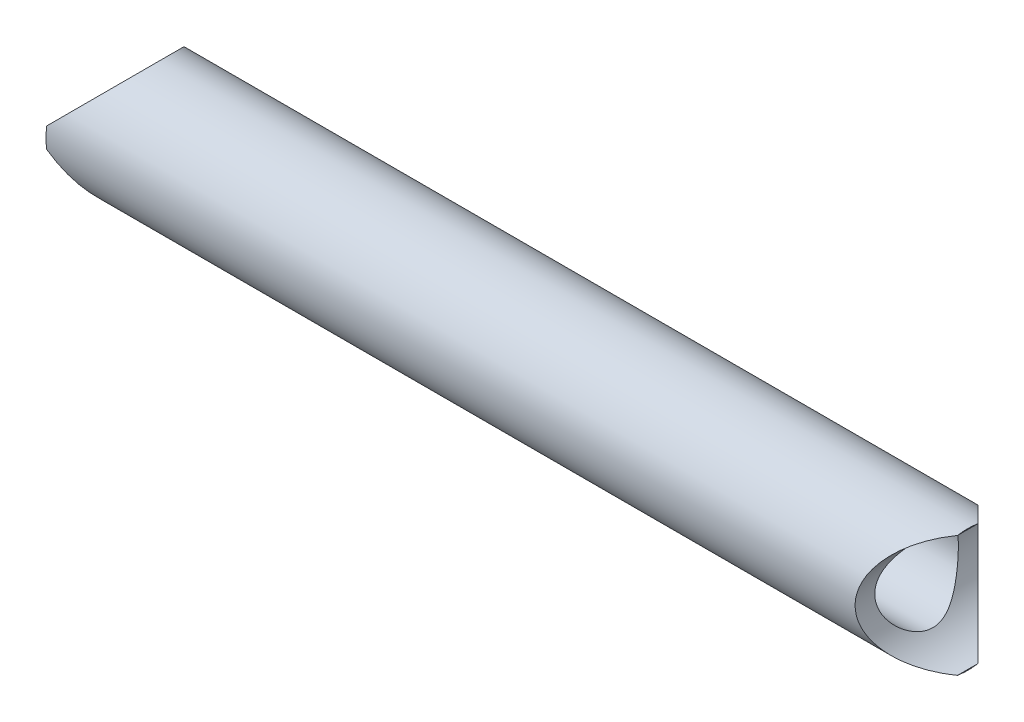
ISO-10303-21;
HEADER;
FILE_DESCRIPTION(('STEP AP214'),'2;1');
FILE_NAME('part.step','',(''),(''),'','','');
FILE_SCHEMA(('AUTOMOTIVE_DESIGN { 1 0 10303 214 1 1 1 1 }'));
ENDSEC;
DATA;
#1=APPLICATION_CONTEXT('core data for automotive mechanical design processes');
#2=APPLICATION_PROTOCOL_DEFINITION('international standard','automotive_design',2000,#1);
#3=PRODUCT_CONTEXT('',#1,'mechanical');
#4=PRODUCT('Part','Part','',(#3));
#5=PRODUCT_RELATED_PRODUCT_CATEGORY('part','',(#4));
#6=PRODUCT_DEFINITION_FORMATION('','',#4);
#7=PRODUCT_DEFINITION_CONTEXT('part definition',#1,'design');
#8=PRODUCT_DEFINITION('design','',#6,#7);
#9=PRODUCT_DEFINITION_SHAPE('','',#8);
#10=(LENGTH_UNIT() NAMED_UNIT(*) SI_UNIT(.MILLI.,.METRE.));
#11=(NAMED_UNIT(*) PLANE_ANGLE_UNIT() SI_UNIT($,.RADIAN.));
#12=(NAMED_UNIT(*) SI_UNIT($,.STERADIAN.) SOLID_ANGLE_UNIT());
#13=UNCERTAINTY_MEASURE_WITH_UNIT(LENGTH_MEASURE(1.E-05),#10,'distance_accuracy_value','');
#14=(GEOMETRIC_REPRESENTATION_CONTEXT(3) GLOBAL_UNCERTAINTY_ASSIGNED_CONTEXT((#13)) GLOBAL_UNIT_ASSIGNED_CONTEXT((#10,
#11,#12)) REPRESENTATION_CONTEXT('',''));
#15=CARTESIAN_POINT('',(0.,0.,0.));
#16=DIRECTION('',(0.,0.,1.));
#17=DIRECTION('',(1.,0.,0.));
#18=AXIS2_PLACEMENT_3D('',#15,#16,#17);
#19=CARTESIAN_POINT('',(-66.675,0.,0.));
#20=DIRECTION('',(1.,0.,0.));
#21=DIRECTION('',(0.,0.,-1.));
#22=AXIS2_PLACEMENT_3D('',#19,#20,#21);
#23=PLANE('',#22);
#24=DIRECTION('',(0.,1.,0.));
#25=VECTOR('',#24,1.);
#26=CARTESIAN_POINT('',(-66.6749999999999,-65.5701,9.39177665567062));
#27=LINE('',#26,#25);
#28=CARTESIAN_POINT('',(-66.6749999999999,1.58750000000007,9.39177665567063));
#29=VERTEX_POINT('',#28);
#30=CARTESIAN_POINT('',(-66.6749999999999,-1.58750000000006,9.39177665567063));
#31=VERTEX_POINT('',#30);
#32=EDGE_CURVE('E120',#29,#31,#27,.F.);
#33=ORIENTED_EDGE('',*,*,#32,.T.);
#34=CARTESIAN_POINT('',(-66.675,0.,0.));
#35=DIRECTION('',(1.,0.,0.));
#36=DIRECTION('',(0.,0.,-1.));
#37=AXIS2_PLACEMENT_3D('',#34,#35,#36);
#38=CIRCLE('',#37,9.525);
#39=EDGE_CURVE('E67',#29,#31,#38,.T.);
#40=ORIENTED_EDGE('',*,*,#39,.F.);
#41=EDGE_LOOP('',(#33,#40));
#42=FACE_BOUND('',#41,.T.);
#43=ADVANCED_FACE('F17',(#42),#23,.F.);
#44=CARTESIAN_POINT('',(66.675,0.,0.));
#45=DIRECTION('',(1.,0.,0.));
#46=DIRECTION('',(0.,0.,-1.));
#47=AXIS2_PLACEMENT_3D('',#44,#45,#46);
#48=PLANE('',#47);
#49=CARTESIAN_POINT('',(66.675,0.,0.));
#50=DIRECTION('',(1.,0.,0.));
#51=DIRECTION('',(0.,0.,-1.));
#52=AXIS2_PLACEMENT_3D('',#49,#50,#51);
#53=CIRCLE('',#52,9.525);
#54=CARTESIAN_POINT('',(66.6749999999999,-9.39177665567063,-1.58750000000006));
#55=VERTEX_POINT('',#54);
#56=CARTESIAN_POINT('',(66.6749999999999,-9.39177665567063,1.58750000000006));
#57=VERTEX_POINT('',#56);
#58=EDGE_CURVE('E62',#55,#57,#53,.F.);
#59=ORIENTED_EDGE('',*,*,#58,.F.);
#60=DIRECTION('',(0.,0.,1.));
#61=VECTOR('',#60,1.);
#62=CARTESIAN_POINT('',(66.6749999999999,-9.39177665567062,-17.0053));
#63=LINE('',#62,#61);
#64=EDGE_CURVE('E65',#55,#57,#63,.T.);
#65=ORIENTED_EDGE('',*,*,#64,.T.);
#66=EDGE_LOOP('',(#59,#65));
#67=FACE_BOUND('',#66,.T.);
#68=ADVANCED_FACE('F64',(#67),#48,.T.);
#69=CARTESIAN_POINT('',(66.675,0.,0.));
#70=DIRECTION('',(1.,0.,0.));
#71=DIRECTION('',(0.,0.,-1.));
#72=AXIS2_PLACEMENT_3D('',#69,#70,#71);
#73=PLANE('',#72);
#74=CARTESIAN_POINT('',(66.675,0.,0.));
#75=DIRECTION('',(1.,0.,0.));
#76=DIRECTION('',(0.,0.,-1.));
#77=AXIS2_PLACEMENT_3D('',#74,#75,#76);
#78=CIRCLE('',#77,9.525);
#79=CARTESIAN_POINT('',(66.6749999999999,9.39177665567063,1.58750000000006));
#80=VERTEX_POINT('',#79);
#81=CARTESIAN_POINT('',(66.6749999999999,9.39177665567063,-1.58750000000006));
#82=VERTEX_POINT('',#81);
#83=EDGE_CURVE('E37',#80,#82,#78,.F.);
#84=ORIENTED_EDGE('',*,*,#83,.F.);
#85=DIRECTION('',(0.,0.,1.));
#86=VECTOR('',#85,1.);
#87=CARTESIAN_POINT('',(66.6749999999999,9.39177665567062,-17.0053));
#88=LINE('',#87,#86);
#89=EDGE_CURVE('E98',#80,#82,#88,.F.);
#90=ORIENTED_EDGE('',*,*,#89,.T.);
#91=EDGE_LOOP('',(#84,#90));
#92=FACE_BOUND('',#91,.T.);
#93=ADVANCED_FACE('F105',(#92),#73,.T.);
#94=CARTESIAN_POINT('',(-66.675,0.,0.));
#95=DIRECTION('',(1.,0.,0.));
#96=DIRECTION('',(0.,0.,-1.));
#97=AXIS2_PLACEMENT_3D('',#94,#95,#96);
#98=CYLINDRICAL_SURFACE('',#97,6.477);
#99=CARTESIAN_POINT('',(-58.7375,-6.477,0.));
#100=CARTESIAN_POINT('',(-58.7375009309845,-6.47699902063564,0.161859991408696));
#101=CARTESIAN_POINT('',(-58.7416352313017,-6.47092347500914,0.323737483139682));
#102=CARTESIAN_POINT('',(-58.7580749166082,-6.44671059452453,0.646234711803034));
#103=CARTESIAN_POINT('',(-58.7703842455682,-6.42856743774703,0.806853803769705));
#104=CARTESIAN_POINT('',(-58.8028997592258,-6.38045887651486,1.12575090691301));
#105=CARTESIAN_POINT('',(-58.8231180709292,-6.35047531625192,1.28402493369037));
#106=CARTESIAN_POINT('',(-58.8709817462166,-6.2791097005026,1.59689476580041));
#107=CARTESIAN_POINT('',(-58.8986303199144,-6.23772271817282,1.751488949823));
#108=CARTESIAN_POINT('',(-58.9605506121295,-6.14437797195406,2.05504483319672));
#109=CARTESIAN_POINT('',(-58.994782172855,-6.09248420539763,2.20403444783158));
#110=CARTESIAN_POINT('',(-59.0692624051674,-5.97857585926296,2.49656391181815));
#111=CARTESIAN_POINT('',(-59.1095134274708,-5.91655732489571,2.64010160450527));
#112=CARTESIAN_POINT('',(-59.2380912058379,-5.71632729768525,3.06131037303474));
#113=CARTESIAN_POINT('',(-59.3343193109037,-5.56382831896324,3.32993886835331));
#114=CARTESIAN_POINT('',(-59.5499985369299,-5.21102308701011,3.86098804990281));
#115=CARTESIAN_POINT('',(-59.6707381932386,-5.00772336343045,4.12086383877963));
#116=CARTESIAN_POINT('',(-59.9203942871404,-4.56617268089548,4.60533984344896));
#117=CARTESIAN_POINT('',(-60.0493229509605,-4.3278687295286,4.82988548670452));
#118=CARTESIAN_POINT('',(-60.2518596404119,-3.92587947637852,5.15511939740143));
#119=CARTESIAN_POINT('',(-60.3261149176989,-3.77252181201225,5.26840752743897));
#120=CARTESIAN_POINT('',(-60.4718575832968,-3.45541080784627,5.48162066039673));
#121=CARTESIAN_POINT('',(-60.5433443038706,-3.29165498498653,5.58154245362993));
#122=CARTESIAN_POINT('',(-60.6809796979498,-2.9544879902085,5.76710565973809));
#123=CARTESIAN_POINT('',(-60.7471368218877,-2.78109287058017,5.85276991837298));
#124=CARTESIAN_POINT('',(-60.8715443252917,-2.42486119568457,6.00910844296647));
#125=CARTESIAN_POINT('',(-60.9297945662624,-2.2420244751174,6.07978244637075));
#126=CARTESIAN_POINT('',(-61.0196570022767,-1.92367949535164,6.18628784096023));
#127=CARTESIAN_POINT('',(-61.0540332217872,-1.79031358505837,6.22622506177775));
#128=CARTESIAN_POINT('',(-61.1163894902453,-1.51989866178684,6.29769648410807));
#129=CARTESIAN_POINT('',(-61.1443713592678,-1.3828507093011,6.32923307718305));
#130=CARTESIAN_POINT('',(-61.1929437695523,-1.10592771933484,6.38344162112075));
#131=CARTESIAN_POINT('',(-61.2135452631584,-0.96605719908589,6.40612671195239));
#132=CARTESIAN_POINT('',(-61.2466180396443,-0.684169243413158,6.44233112113181));
#133=CARTESIAN_POINT('',(-61.2590893004972,-0.542151802173897,6.45585041464713));
#134=CARTESIAN_POINT('',(-61.2754143867462,-0.256348970234707,6.47351588669589));
#135=CARTESIAN_POINT('',(-61.2792266766402,-0.11255837083368,6.47761688844381));
#136=CARTESIAN_POINT('',(-61.2779433268486,0.174934617387533,6.47623293328364));
#137=CARTESIAN_POINT('',(-61.2728476835599,0.318637006172016,6.4707479724982));
#138=CARTESIAN_POINT('',(-61.2539644766221,0.604877368980779,6.45029057713175));
#139=CARTESIAN_POINT('',(-61.2401714756774,0.747414558054186,6.43531220756058));
#140=CARTESIAN_POINT('',(-61.204482809079,1.03015441555673,6.39614774621474));
#141=CARTESIAN_POINT('',(-61.1825869583412,1.17035703058341,6.37196144411342));
#142=CARTESIAN_POINT('',(-61.1086643114976,1.57151737734538,6.28916546635215));
#143=CARTESIAN_POINT('',(-61.0471941561119,1.82846527571214,6.21910574963729));
#144=CARTESIAN_POINT('',(-60.9050680101041,2.32704967278988,6.05027939563834));
#145=CARTESIAN_POINT('',(-60.8243971590256,2.56867412750302,5.95149051009416));
#146=CARTESIAN_POINT('',(-60.6730152437242,2.97524781039389,5.75642971591142));
#147=CARTESIAN_POINT('',(-60.605009123286,3.14403898346143,5.66593829377763));
#148=CARTESIAN_POINT('',(-60.4647293821883,3.471754534595,5.47126926165319));
#149=CARTESIAN_POINT('',(-60.392454186027,3.63067522500949,5.36708658131105));
#150=CARTESIAN_POINT('',(-60.2458300224296,3.9384300509092,5.14551354529919));
#151=CARTESIAN_POINT('',(-60.1714778932225,4.08724747553892,5.02810212298997));
#152=CARTESIAN_POINT('',(-60.0228775284381,4.37405079028782,4.78069737839076));
#153=CARTESIAN_POINT('',(-59.9486292815466,4.51203796771267,4.65070555554734));
#154=CARTESIAN_POINT('',(-59.801496934869,4.7777417550274,4.37736795593037));
#155=CARTESIAN_POINT('',(-59.7286300847361,4.9053597052468,4.23391683747296));
#156=CARTESIAN_POINT('',(-59.5867660040007,5.14820099638157,3.93505085849178));
#157=CARTESIAN_POINT('',(-59.5177691424325,5.26342315621798,3.77963486036259));
#158=CARTESIAN_POINT('',(-59.385533224316,5.48031192519517,3.45764864801704));
#159=CARTESIAN_POINT('',(-59.3222861594534,5.58199748275943,3.29109452645894));
#160=CARTESIAN_POINT('',(-59.2031853095816,5.77082786323259,2.9474527949776));
#161=CARTESIAN_POINT('',(-59.1473290729144,5.85797751045143,2.77036870641004));
#162=CARTESIAN_POINT('',(-59.0560056820141,5.99897047854086,2.44698855291379));
#163=CARTESIAN_POINT('',(-59.0187608551921,6.05591773029685,2.30253994989054));
#164=CARTESIAN_POINT('',(-58.9504752329718,6.1596457176452,2.00862296214987));
#165=CARTESIAN_POINT('',(-58.9194331975385,6.2064284854405,1.85915558775619));
#166=CARTESIAN_POINT('',(-58.8642534951206,6.28918836563251,1.55634958893366));
#167=CARTESIAN_POINT('',(-58.8401016523863,6.32518767146095,1.40301962952514));
#168=CARTESIAN_POINT('',(-58.7991588939474,6.3860188295028,1.09324664274338));
#169=CARTESIAN_POINT('',(-58.7823647372085,6.41085559889845,0.936805017859292));
#170=CARTESIAN_POINT('',(-58.758849337593,6.44557282711493,0.650388584800368));
#171=CARTESIAN_POINT('',(-58.750855732223,6.45734574240924,0.520743628143346));
#172=CARTESIAN_POINT('',(-58.7401801748846,6.47306048049024,0.260736321547767));
#173=CARTESIAN_POINT('',(-58.7374992501172,6.47700078885146,0.130373837761212));
#174=CARTESIAN_POINT('',(-58.7375009309845,6.47699902063564,-0.161859991408695));
#175=CARTESIAN_POINT('',(-58.7416352313017,6.47092347500914,-0.323737483139681));
#176=CARTESIAN_POINT('',(-58.7580749166082,6.44671059452453,-0.646234711803033));
#177=CARTESIAN_POINT('',(-58.7703842455682,6.42856743774703,-0.806853803769704));
#178=CARTESIAN_POINT('',(-58.8028997592258,6.38045887651486,-1.12575090691301));
#179=CARTESIAN_POINT('',(-58.8231180709292,6.35047531625192,-1.28402493369037));
#180=CARTESIAN_POINT('',(-58.8709817462166,6.2791097005026,-1.59689476580041));
#181=CARTESIAN_POINT('',(-58.8986303199144,6.23772271817283,-1.751488949823));
#182=CARTESIAN_POINT('',(-58.9605506121295,6.14437797195406,-2.05504483319671));
#183=CARTESIAN_POINT('',(-58.994782172855,6.09248420539763,-2.20403444783158));
#184=CARTESIAN_POINT('',(-59.0692624051674,5.97857585926296,-2.49656391181815));
#185=CARTESIAN_POINT('',(-59.1095134274708,5.91655732489572,-2.64010160450527));
#186=CARTESIAN_POINT('',(-59.2380912058379,5.71632729768525,-3.06131037303474));
#187=CARTESIAN_POINT('',(-59.3343193109037,5.56382831896325,-3.3299388683533));
#188=CARTESIAN_POINT('',(-59.5499985369299,5.21102308701011,-3.86098804990281));
#189=CARTESIAN_POINT('',(-59.6707381932385,5.00772336343045,-4.12086383877963));
#190=CARTESIAN_POINT('',(-59.9203942871403,4.56617268089548,-4.60533984344896));
#191=CARTESIAN_POINT('',(-60.0493229509605,4.3278687295286,-4.82988548670452));
#192=CARTESIAN_POINT('',(-60.2518596404119,3.92587947637852,-5.15511939740143));
#193=CARTESIAN_POINT('',(-60.3261149176989,3.77252181201225,-5.26840752743897));
#194=CARTESIAN_POINT('',(-60.4718575832968,3.45541080784627,-5.48162066039673));
#195=CARTESIAN_POINT('',(-60.5433443038706,3.29165498498653,-5.58154245362992));
#196=CARTESIAN_POINT('',(-60.6809796979498,2.9544879902085,-5.76710565973809));
#197=CARTESIAN_POINT('',(-60.7471368218877,2.78109287058017,-5.85276991837298));
#198=CARTESIAN_POINT('',(-60.8715443252917,2.42486119568457,-6.00910844296646));
#199=CARTESIAN_POINT('',(-60.9297945662624,2.2420244751174,-6.07978244637075));
#200=CARTESIAN_POINT('',(-61.0196570022767,1.92367949535164,-6.18628784096023));
#201=CARTESIAN_POINT('',(-61.0540332217872,1.79031358505837,-6.22622506177775));
#202=CARTESIAN_POINT('',(-61.1163894902453,1.51989866178684,-6.29769648410807));
#203=CARTESIAN_POINT('',(-61.1443713592678,1.3828507093011,-6.32923307718305));
#204=CARTESIAN_POINT('',(-61.1929437695523,1.10592771933485,-6.38344162112075));
#205=CARTESIAN_POINT('',(-61.2135452631584,0.966057199085892,-6.40612671195239));
#206=CARTESIAN_POINT('',(-61.2466180396443,0.684169243413161,-6.44233112113181));
#207=CARTESIAN_POINT('',(-61.2590893004972,0.542151802173898,-6.45585041464713));
#208=CARTESIAN_POINT('',(-61.2754143867462,0.256348970234709,-6.47351588669589));
#209=CARTESIAN_POINT('',(-61.2792266766402,0.112558370833682,-6.47761688844381));
#210=CARTESIAN_POINT('',(-61.2779433268486,-0.174934617387529,-6.47623293328364));
#211=CARTESIAN_POINT('',(-61.2728476835599,-0.318637006172012,-6.4707479724982));
#212=CARTESIAN_POINT('',(-61.2539644766221,-0.604877368980775,-6.45029057713175));
#213=CARTESIAN_POINT('',(-61.2401714756774,-0.747414558054183,-6.43531220756058));
#214=CARTESIAN_POINT('',(-61.204482809079,-1.03015441555673,-6.39614774621474));
#215=CARTESIAN_POINT('',(-61.1825869583412,-1.1703570305834,-6.37196144411342));
#216=CARTESIAN_POINT('',(-61.1086643114976,-1.57151737734537,-6.28916546635215));
#217=CARTESIAN_POINT('',(-61.0471941561119,-1.82846527571213,-6.21910574963729));
#218=CARTESIAN_POINT('',(-60.9050680101041,-2.32704967278987,-6.05027939563834));
#219=CARTESIAN_POINT('',(-60.8243971590256,-2.56867412750302,-5.95149051009416));
#220=CARTESIAN_POINT('',(-60.6730152437242,-2.97524781039389,-5.75642971591142));
#221=CARTESIAN_POINT('',(-60.605009123286,-3.14403898346143,-5.66593829377763));
#222=CARTESIAN_POINT('',(-60.4647293821883,-3.471754534595,-5.47126926165319));
#223=CARTESIAN_POINT('',(-60.392454186027,-3.63067522500949,-5.36708658131105));
#224=CARTESIAN_POINT('',(-60.2458300224296,-3.9384300509092,-5.14551354529919));
#225=CARTESIAN_POINT('',(-60.1714778932225,-4.08724747553892,-5.02810212298997));
#226=CARTESIAN_POINT('',(-60.0228775284381,-4.37405079028782,-4.78069737839076));
#227=CARTESIAN_POINT('',(-59.9486292815466,-4.51203796771267,-4.65070555554734));
#228=CARTESIAN_POINT('',(-59.801496934869,-4.7777417550274,-4.37736795593037));
#229=CARTESIAN_POINT('',(-59.7286300847361,-4.9053597052468,-4.23391683747297));
#230=CARTESIAN_POINT('',(-59.5867660040007,-5.14820099638156,-3.93505085849178));
#231=CARTESIAN_POINT('',(-59.5177691424325,-5.26342315621798,-3.77963486036259));
#232=CARTESIAN_POINT('',(-59.385533224316,-5.48031192519517,-3.45764864801704));
#233=CARTESIAN_POINT('',(-59.3222861594534,-5.58199748275943,-3.29109452645894));
#234=CARTESIAN_POINT('',(-59.2031853095816,-5.77082786323259,-2.9474527949776));
#235=CARTESIAN_POINT('',(-59.1473290729144,-5.85797751045144,-2.77036870641003));
#236=CARTESIAN_POINT('',(-59.0560056820141,-5.99897047854086,-2.44698855291379));
#237=CARTESIAN_POINT('',(-59.0187608551921,-6.05591773029685,-2.30253994989054));
#238=CARTESIAN_POINT('',(-58.9504752329718,-6.1596457176452,-2.00862296214987));
#239=CARTESIAN_POINT('',(-58.9194331975385,-6.2064284854405,-1.85915558775618));
#240=CARTESIAN_POINT('',(-58.8642534951206,-6.28918836563251,-1.55634958893366));
#241=CARTESIAN_POINT('',(-58.8401016523863,-6.32518767146095,-1.40301962952514));
#242=CARTESIAN_POINT('',(-58.7991588939474,-6.3860188295028,-1.09324664274338));
#243=CARTESIAN_POINT('',(-58.7823647372085,-6.41085559889845,-0.936805017859292));
#244=CARTESIAN_POINT('',(-58.758849337593,-6.44557282711493,-0.650388584800367));
#245=CARTESIAN_POINT('',(-58.750855732223,-6.45734574240924,-0.520743628143346));
#246=CARTESIAN_POINT('',(-58.7401801748846,-6.47306048049024,-0.260736321547767));
#247=CARTESIAN_POINT('',(-58.7374992501172,-6.47700078885146,-0.130373837761212));
#248=CARTESIAN_POINT('',(-58.7375,-6.477,0.));
#249=B_SPLINE_CURVE_WITH_KNOTS('',3,(#99,#100,#101,#102,#103,#104,#105,#106,#107,#108,#109,#110,
#111,#112,#113,#114,#115,#116,#117,#118,#119,#120,#121,#122,#123,#124,#125,#126,#127,#128,#129,
#130,#131,#132,#133,#134,#135,#136,#137,#138,#139,#140,#141,#142,#143,#144,#145,#146,#147,#148,
#149,#150,#151,#152,#153,#154,#155,#156,#157,#158,#159,#160,#161,#162,#163,#164,#165,#166,#167,
#168,#169,#170,#171,#172,#173,#174,#175,#176,#177,#178,#179,#180,#181,#182,#183,#184,#185,#186,
#187,#188,#189,#190,#191,#192,#193,#194,#195,#196,#197,#198,#199,#200,#201,#202,#203,#204,#205,
#206,#207,#208,#209,#210,#211,#212,#213,#214,#215,#216,#217,#218,#219,#220,#221,#222,#223,#224,
#225,#226,#227,#228,#229,#230,#231,#232,#233,#234,#235,#236,#237,#238,#239,#240,#241,#242,#243,
#244,#245,#246,#247,#248),.UNSPECIFIED.,.T.,.F.,(4,2,2,2,2,2,2,2,2,2,2,2,2,2,2,2,2,2,2,2,2,2,2,
2,2,2,2,2,2,2,2,2,2,2,2,2,2,2,2,2,2,2,2,2,2,2,2,2,2,2,2,2,2,2,2,2,2,2,2,2,2,2,2,2,2,2,2,2,2,2,2,
2,2,2,4),(0.,0.485445035240253,0.971124439466946,1.45755148350196,1.94418901856093,
2.42794707431411,2.9118945426819,3.87864232463296,4.92897664541365,5.98091776126258,
6.59415554899405,7.20754033148496,7.81993258303057,8.4323355597404,8.86214713662766,
9.29183622000594,9.72088498500895,10.1499349124087,10.5810386062942,11.0121424745532,
11.4435161220252,11.8748996234808,12.6916407028376,13.509015969617,14.1179849928111,
14.7271801774201,15.3373595897461,15.9474663646979,16.5628261978056,17.1782446109664,
17.7927922991829,18.4071356181225,18.8856747696513,19.3641181577961,19.8415699875788,
20.3188112895577,20.7097485332311,21.1007613568175,21.5862063920578,22.0718857962845,
22.5583128403195,23.0449503753785,23.5287084311317,24.0126558994994,24.9794036814505,
26.0297380022312,27.0816791180801,27.6949169058116,28.3083016883025,28.9206939398481,
29.5330969165579,29.9629084934452,30.3925975768235,30.8216463418265,31.2506962692262,
31.6817999631117,32.1129038313707,32.5442774788427,32.9756609802984,33.7924020596551,
34.6097773264346,35.2187463496287,35.8279415342376,36.4381209465637,37.0482277215154,
37.6635875546231,38.279005967784,38.8935536560004,39.50789697494,39.9864361264688,
40.4648795146136,40.9423313443963,41.4195726463752,41.8105098900486,42.2015227136351),.UNSPECIFIED.);
#250=CARTESIAN_POINT('',(-58.7375,-6.477,0.));
#251=VERTEX_POINT('',#250);
#252=EDGE_CURVE('E20',#251,#251,#249,.T.);
#253=ORIENTED_EDGE('',*,*,#252,.T.);
#254=EDGE_LOOP('',(#253));
#255=FACE_BOUND('',#254,.T.);
#256=CARTESIAN_POINT('',(61.2786546408873,-6.477,0.));
#257=CARTESIAN_POINT('',(61.2786539024691,-6.47699958125814,-0.156993238287498));
#258=CARTESIAN_POINT('',(61.2733367297598,-6.47128014816112,-0.31399167172557));
#259=CARTESIAN_POINT('',(61.2523430316159,-6.44853149569742,-0.626531109765145));
#260=CARTESIAN_POINT('',(61.2366612617773,-6.43149655074967,-0.782071336096458));
#261=CARTESIAN_POINT('',(61.1956761967234,-6.38643473583647,-1.09056146682464));
#262=CARTESIAN_POINT('',(61.1703544051246,-6.35838673176235,-1.24350579744953));
#263=CARTESIAN_POINT('',(61.1112366138649,-6.29182277695146,-1.54545734761035));
#264=CARTESIAN_POINT('',(61.0774360456298,-6.25330118184367,-1.69446239656329));
#265=CARTESIAN_POINT('',(60.966138075222,-6.12385242056868,-2.13103278103979));
#266=CARTESIAN_POINT('',(60.8782059379256,-6.01848828921765,-2.41178661123202));
#267=CARTESIAN_POINT('',(60.6850267099822,-5.77337406153075,-2.95087115636755));
#268=CARTESIAN_POINT('',(60.579778662305,-5.63362206440577,-3.20920063073656));
#269=CARTESIAN_POINT('',(60.3431813304634,-5.29705838244649,-3.74267458076843));
#270=CARTESIAN_POINT('',(60.210375526714,-5.09465674418815,-4.01368285175551));
#271=CARTESIAN_POINT('',(60.011908296337,-4.76132571659908,-4.3942925150245));
#272=CARTESIAN_POINT('',(59.9458198299071,-4.64514829934261,-4.51693922154632));
#273=CARTESIAN_POINT('',(59.8151595814003,-4.40306222488188,-4.75322810737947));
#274=CARTESIAN_POINT('',(59.7505881235186,-4.27715151183356,-4.86686837404967));
#275=CARTESIAN_POINT('',(59.614564541866,-3.99585507588413,-5.10128901380754));
#276=CARTESIAN_POINT('',(59.5435806275099,-3.83891376996024,-5.22048146520297));
#277=CARTESIAN_POINT('',(59.4073137391931,-3.51318193146084,-5.44501452956353));
#278=CARTESIAN_POINT('',(59.3420282661365,-3.34439665233577,-5.55036122504945));
#279=CARTESIAN_POINT('',(59.2190433310947,-2.99593270751516,-5.74593638400686));
#280=CARTESIAN_POINT('',(59.1613347570076,-2.81626751347488,-5.83618304355515));
#281=CARTESIAN_POINT('',(59.0551940750646,-2.44703786684533,-6.00035920931032));
#282=CARTESIAN_POINT('',(59.0067582351419,-2.25747743612646,-6.07429528199395));
#283=CARTESIAN_POINT('',(58.9318077435233,-1.91978797337572,-6.18781339836189));
#284=CARTESIAN_POINT('',(58.9028574965064,-1.77351265464621,-6.23134223505863));
#285=CARTESIAN_POINT('',(58.8515404651901,-1.47717944501002,-6.30816002296597));
#286=CARTESIAN_POINT('',(58.829172260196,-1.32712237797378,-6.34145118398812));
#287=CARTESIAN_POINT('',(58.7915013685179,-1.02424838485167,-6.39735455072021));
#288=CARTESIAN_POINT('',(58.7761944339112,-0.871433175663083,-6.41997317700684));
#289=CARTESIAN_POINT('',(58.752963922023,-0.564011087776691,-6.45424974192859));
#290=CARTESIAN_POINT('',(58.7450405894542,-0.409404149868061,-6.46590731728491));
#291=CARTESIAN_POINT('',(58.7367522993959,-0.0992833672738446,-6.47810106801656));
#292=CARTESIAN_POINT('',(58.7364002841701,0.0562315758506255,-6.47861820013579));
#293=CARTESIAN_POINT('',(58.7432956322135,0.366725115293332,-6.46847505037467));
#294=CARTESIAN_POINT('',(58.7505429673069,0.521703713598018,-6.45781480993628));
#295=CARTESIAN_POINT('',(58.7724736268356,0.830008776830453,-6.42546851963407));
#296=CARTESIAN_POINT('',(58.7871587908677,0.983334823447081,-6.40377974207916));
#297=CARTESIAN_POINT('',(58.8236374984345,1.28721532801447,-6.34967931849525));
#298=CARTESIAN_POINT('',(58.8454310654023,1.43776977682688,-6.31726763711799));
#299=CARTESIAN_POINT('',(58.8951897463165,1.7323417035847,-6.24284851377106));
#300=CARTESIAN_POINT('',(58.9230307013767,1.87642891805979,-6.20103359453065));
#301=CARTESIAN_POINT('',(58.9845668505618,2.16025612190623,-6.10795864315161));
#302=CARTESIAN_POINT('',(59.018264101418,2.29999456359112,-6.0566952923392));
#303=CARTESIAN_POINT('',(59.1272203070789,2.71157562008681,-5.88951979811742));
#304=CARTESIAN_POINT('',(59.2103829781254,2.97600807920312,-5.76016464676438));
#305=CARTESIAN_POINT('',(59.4024961689719,3.50931215208,-5.45357052913664));
#306=CARTESIAN_POINT('',(59.5132967608584,3.77532499646092,-5.27257788866768));
#307=CARTESIAN_POINT('',(59.746347457798,4.27514018811236,-4.87612283887938));
#308=CARTESIAN_POINT('',(59.8686108364192,4.50890439894704,-4.66062025850689));
#309=CARTESIAN_POINT('',(60.064553013561,4.85186788077691,-4.29478468700461));
#310=CARTESIAN_POINT('',(60.1373466180653,4.97251339760098,-4.15450186746748));
#311=CARTESIAN_POINT('',(60.2820790189347,5.20161921556812,-3.86379854907408));
#312=CARTESIAN_POINT('',(60.3540176336399,5.31007696714517,-3.71337593955905));
#313=CARTESIAN_POINT('',(60.4949654523979,5.51420100933162,-3.40288166607066));
#314=CARTESIAN_POINT('',(60.5639760439499,5.60987340579065,-3.24281466130517));
#315=CARTESIAN_POINT('',(60.6968485827697,5.78782154443758,-2.91337456881312));
#316=CARTESIAN_POINT('',(60.7607097517992,5.87009526357647,-2.74400008091561));
#317=CARTESIAN_POINT('',(60.9113810427574,6.05869313718702,-2.30766197338943));
#318=CARTESIAN_POINT('',(60.9933407184926,6.15596292733698,-2.03488273594761));
#319=CARTESIAN_POINT('',(61.0959443152096,6.27445842847288,-1.6136816325151));
#320=CARTESIAN_POINT('',(61.1267357173416,6.30936766442503,-1.4714228050697));
#321=CARTESIAN_POINT('',(61.1805006422801,6.36965820808408,-1.1834630594066));
#322=CARTESIAN_POINT('',(61.2034776023047,6.39504370535902,-1.03776368476692));
#323=CARTESIAN_POINT('',(61.2406384243204,6.43582557593489,-0.744063894192941));
#324=CARTESIAN_POINT('',(61.2548343457654,6.45123565035913,-0.59606692148647));
#325=CARTESIAN_POINT('',(61.2738440352493,6.47182440285379,-0.298715097073168));
#326=CARTESIAN_POINT('',(61.2786553434021,6.47700039838176,-0.149359899653762));
#327=CARTESIAN_POINT('',(61.2786539024691,6.47699958125814,0.156993238287498));
#328=CARTESIAN_POINT('',(61.2733367297598,6.47128014816112,0.313991671725569));
#329=CARTESIAN_POINT('',(61.2523430316159,6.44853149569742,0.626531109765144));
#330=CARTESIAN_POINT('',(61.2366612617773,6.43149655074967,0.782071336096457));
#331=CARTESIAN_POINT('',(61.1956761967234,6.38643473583647,1.09056146682464));
#332=CARTESIAN_POINT('',(61.1703544051246,6.35838673176235,1.24350579744953));
#333=CARTESIAN_POINT('',(61.1112366138649,6.29182277695146,1.54545734761035));
#334=CARTESIAN_POINT('',(61.0774360456298,6.25330118184367,1.69446239656329));
#335=CARTESIAN_POINT('',(60.966138075222,6.12385242056868,2.13103278103979));
#336=CARTESIAN_POINT('',(60.8782059379256,6.01848828921765,2.41178661123202));
#337=CARTESIAN_POINT('',(60.6850267099822,5.77337406153075,2.95087115636755));
#338=CARTESIAN_POINT('',(60.579778662305,5.63362206440577,3.20920063073656));
#339=CARTESIAN_POINT('',(60.3431813304634,5.29705838244649,3.74267458076843));
#340=CARTESIAN_POINT('',(60.210375526714,5.09465674418814,4.01368285175551));
#341=CARTESIAN_POINT('',(60.011908296337,4.76132571659907,4.3942925150245));
#342=CARTESIAN_POINT('',(59.9458198299071,4.64514829934261,4.51693922154632));
#343=CARTESIAN_POINT('',(59.8151595814003,4.40306222488188,4.75322810737947));
#344=CARTESIAN_POINT('',(59.7505881235186,4.27715151183356,4.86686837404967));
#345=CARTESIAN_POINT('',(59.6145645418661,3.99585507588413,5.10128901380754));
#346=CARTESIAN_POINT('',(59.5435806275099,3.83891376996024,5.22048146520297));
#347=CARTESIAN_POINT('',(59.4073137391931,3.51318193146084,5.44501452956353));
#348=CARTESIAN_POINT('',(59.3420282661365,3.34439665233577,5.55036122504945));
#349=CARTESIAN_POINT('',(59.2190433310947,2.99593270751516,5.74593638400686));
#350=CARTESIAN_POINT('',(59.1613347570076,2.81626751347487,5.83618304355515));
#351=CARTESIAN_POINT('',(59.0551940750646,2.44703786684533,6.00035920931032));
#352=CARTESIAN_POINT('',(59.0067582351419,2.25747743612646,6.07429528199395));
#353=CARTESIAN_POINT('',(58.9318077435233,1.91978797337572,6.18781339836189));
#354=CARTESIAN_POINT('',(58.9028574965064,1.77351265464621,6.23134223505864));
#355=CARTESIAN_POINT('',(58.8515404651901,1.47717944501002,6.30816002296597));
#356=CARTESIAN_POINT('',(58.829172260196,1.32712237797377,6.34145118398813));
#357=CARTESIAN_POINT('',(58.7915013685179,1.02424838485167,6.39735455072021));
#358=CARTESIAN_POINT('',(58.7761944339112,0.871433175663079,6.41997317700684));
#359=CARTESIAN_POINT('',(58.752963922023,0.564011087776687,6.45424974192859));
#360=CARTESIAN_POINT('',(58.7450405894542,0.409404149868058,6.46590731728491));
#361=CARTESIAN_POINT('',(58.7367522993959,0.0992833672738409,6.47810106801656));
#362=CARTESIAN_POINT('',(58.7364002841701,-0.0562315758506291,6.47861820013579));
#363=CARTESIAN_POINT('',(58.7432956322135,-0.366725115293336,6.46847505037467));
#364=CARTESIAN_POINT('',(58.7505429673069,-0.521703713598022,6.45781480993628));
#365=CARTESIAN_POINT('',(58.7724736268356,-0.830008776830458,6.42546851963407));
#366=CARTESIAN_POINT('',(58.7871587908677,-0.983334823447086,6.40377974207916));
#367=CARTESIAN_POINT('',(58.8236374984345,-1.28721532801448,6.34967931849525));
#368=CARTESIAN_POINT('',(58.8454310654023,-1.43776977682688,6.31726763711799));
#369=CARTESIAN_POINT('',(58.8951897463165,-1.73234170358471,6.24284851377106));
#370=CARTESIAN_POINT('',(58.9230307013767,-1.87642891805979,6.20103359453065));
#371=CARTESIAN_POINT('',(58.9845668505618,-2.16025612190623,6.10795864315161));
#372=CARTESIAN_POINT('',(59.018264101418,-2.29999456359112,6.0566952923392));
#373=CARTESIAN_POINT('',(59.1272203070789,-2.71157562008681,5.88951979811741));
#374=CARTESIAN_POINT('',(59.2103829781254,-2.97600807920312,5.76016464676438));
#375=CARTESIAN_POINT('',(59.4024961689719,-3.50931215208001,5.45357052913664));
#376=CARTESIAN_POINT('',(59.5132967608584,-3.77532499646092,5.27257788866768));
#377=CARTESIAN_POINT('',(59.746347457798,-4.27514018811237,4.87612283887938));
#378=CARTESIAN_POINT('',(59.8686108364192,-4.50890439894705,4.66062025850689));
#379=CARTESIAN_POINT('',(60.064553013561,-4.85186788077692,4.2947846870046));
#380=CARTESIAN_POINT('',(60.1373466180653,-4.97251339760099,4.15450186746748));
#381=CARTESIAN_POINT('',(60.2820790189347,-5.20161921556812,3.86379854907408));
#382=CARTESIAN_POINT('',(60.3540176336399,-5.31007696714517,3.71337593955904));
#383=CARTESIAN_POINT('',(60.4949654523979,-5.51420100933162,3.40288166607066));
#384=CARTESIAN_POINT('',(60.5639760439499,-5.60987340579065,3.24281466130517));
#385=CARTESIAN_POINT('',(60.6968485827697,-5.78782154443758,2.91337456881311));
#386=CARTESIAN_POINT('',(60.7607097517992,-5.87009526357648,2.74400008091561));
#387=CARTESIAN_POINT('',(60.9113810427574,-6.05869313718702,2.30766197338943));
#388=CARTESIAN_POINT('',(60.9933407184926,-6.15596292733698,2.03488273594761));
#389=CARTESIAN_POINT('',(61.0959443152096,-6.27445842847288,1.6136816325151));
#390=CARTESIAN_POINT('',(61.1267357173416,-6.30936766442503,1.47142280506969));
#391=CARTESIAN_POINT('',(61.1805006422801,-6.36965820808408,1.1834630594066));
#392=CARTESIAN_POINT('',(61.2034776023047,-6.39504370535902,1.03776368476692));
#393=CARTESIAN_POINT('',(61.2406384243204,-6.43582557593489,0.744063894192937));
#394=CARTESIAN_POINT('',(61.2548343457654,-6.45123565035913,0.596066921486467));
#395=CARTESIAN_POINT('',(61.2738440352493,-6.47182440285379,0.298715097073167));
#396=CARTESIAN_POINT('',(61.2786553434021,-6.47700039838176,0.149359899653762));
#397=CARTESIAN_POINT('',(61.2786546408873,-6.477,0.));
#398=B_SPLINE_CURVE_WITH_KNOTS('',3,(#256,#257,#258,#259,#260,#261,#262,#263,#264,#265,#266,
#267,#268,#269,#270,#271,#272,#273,#274,#275,#276,#277,#278,#279,#280,#281,#282,#283,#284,#285,
#286,#287,#288,#289,#290,#291,#292,#293,#294,#295,#296,#297,#298,#299,#300,#301,#302,#303,#304,
#305,#306,#307,#308,#309,#310,#311,#312,#313,#314,#315,#316,#317,#318,#319,#320,#321,#322,#323,
#324,#325,#326,#327,#328,#329,#330,#331,#332,#333,#334,#335,#336,#337,#338,#339,#340,#341,#342,
#343,#344,#345,#346,#347,#348,#349,#350,#351,#352,#353,#354,#355,#356,#357,#358,#359,#360,#361,
#362,#363,#364,#365,#366,#367,#368,#369,#370,#371,#372,#373,#374,#375,#376,#377,#378,#379,#380,
#381,#382,#383,#384,#385,#386,#387,#388,#389,#390,#391,#392,#393,#394,#395,#396,#397),
.UNSPECIFIED.,.T.,.F.,(4,2,2,2,2,2,2,2,2,2,2,2,2,2,2,2,2,2,2,2,2,2,2,2,2,2,2,2,2,2,2,2,2,2,2,2,
2,2,2,2,2,2,2,2,2,2,2,2,2,2,2,2,2,2,2,2,2,2,2,2,2,2,2,2,2,2,2,2,2,2,4),(0.,0.470797949304944,
0.941834301196094,1.4137790266955,1.88597859595497,2.81937867426803,3.75283035786007,
4.83862140692956,5.38244957632978,5.92639292736045,6.55395511907762,7.18124069096551,
7.80776483091004,8.43403627640862,8.8995652514284,9.36499367095161,9.83014173149174,
10.2953052077506,10.7612637623964,11.2272205894304,11.6932927177901,12.1593663825809,
12.6166491285128,13.0740927979079,13.9882834862431,15.0055105704002,16.0239304749172,
16.6198797740686,17.2159535090477,17.8117415544251,18.4076194738351,19.3066043317922,
19.7552085164466,20.2036151245215,20.6514045373633,21.0993113085875,21.5701092578924,
22.0411456097835,22.5130903352829,22.9852899045424,23.9186899828555,24.8521416664475,
25.937932715517,26.4817608849172,27.0257042359479,27.6532664276651,28.280551999553,
28.9070761394975,29.5333475849961,29.9988765600158,30.4643049795391,30.9294530400792,
31.3946165163381,31.8605750709838,32.3265318980179,32.7926040263776,33.2586776911683,
33.7159604371002,34.1734041064954,35.0875947948305,36.1048218789876,37.1232417835047,
37.719191082656,38.3152648176351,38.9110528630125,39.5069307824225,40.4059156403796,
40.854519825034,41.3029264331089,41.7507158459507,42.1986226171749),.UNSPECIFIED.);
#399=CARTESIAN_POINT('',(61.2786546408873,-6.477,0.));
#400=VERTEX_POINT('',#399);
#401=EDGE_CURVE('E91',#400,#400,#398,.T.);
#402=ORIENTED_EDGE('',*,*,#401,.T.);
#403=EDGE_LOOP('',(#402));
#404=FACE_BOUND('',#403,.T.);
#405=ADVANCED_FACE('F100',(#255,#404),#98,.F.);
#406=CARTESIAN_POINT('',(-66.675,0.,0.));
#407=DIRECTION('',(1.,0.,0.));
#408=DIRECTION('',(0.,0.,-1.));
#409=AXIS2_PLACEMENT_3D('',#406,#407,#408);
#410=PLANE('',#409);
#411=DIRECTION('',(0.,1.,0.));
#412=VECTOR('',#411,1.);
#413=CARTESIAN_POINT('',(-66.6749999999999,-65.5701,-9.39177665567062));
#414=LINE('',#413,#412);
#415=CARTESIAN_POINT('',(-66.6749999999999,-1.58750000000006,-9.39177665567063));
#416=VERTEX_POINT('',#415);
#417=CARTESIAN_POINT('',(-66.6749999999999,1.58750000000007,-9.39177665567063));
#418=VERTEX_POINT('',#417);
#419=EDGE_CURVE('E57',#416,#418,#414,.T.);
#420=ORIENTED_EDGE('',*,*,#419,.T.);
#421=CARTESIAN_POINT('',(-66.675,0.,0.));
#422=DIRECTION('',(1.,0.,0.));
#423=DIRECTION('',(0.,0.,-1.));
#424=AXIS2_PLACEMENT_3D('',#421,#422,#423);
#425=CIRCLE('',#424,9.525);
#426=EDGE_CURVE('E131',#416,#418,#425,.T.);
#427=ORIENTED_EDGE('',*,*,#426,.F.);
#428=EDGE_LOOP('',(#420,#427));
#429=FACE_BOUND('',#428,.T.);
#430=ADVANCED_FACE('F104',(#429),#410,.F.);
#431=CARTESIAN_POINT('',(-68.2625,-65.5701,0.));
#432=DIRECTION('',(0.,1.,0.));
#433=DIRECTION('',(0.,0.,1.));
#434=AXIS2_PLACEMENT_3D('',#431,#432,#433);
#435=CYLINDRICAL_SURFACE('',#434,9.525);
#436=ORIENTED_EDGE('',*,*,#252,.F.);
#437=EDGE_LOOP('',(#436));
#438=FACE_BOUND('',#437,.T.);
#439=CARTESIAN_POINT('',(-68.2625,0.,0.));
#440=DIRECTION('',(0.707106781186547,0.707106781186547,0.));
#441=DIRECTION('',(-0.707106781186547,0.707106781186547,0.));
#442=AXIS2_PLACEMENT_3D('',#439,#440,#441);
#443=ELLIPSE('',#442,13.4703841816037,9.525);
#444=EDGE_CURVE('E97',#31,#416,#443,.T.);
#445=ORIENTED_EDGE('',*,*,#444,.F.);
#446=ORIENTED_EDGE('',*,*,#32,.F.);
#447=CARTESIAN_POINT('',(-68.2625,0.,0.));
#448=DIRECTION('',(-0.707106781186547,0.707106781186547,0.));
#449=DIRECTION('',(0.707106781186547,0.707106781186547,0.));
#450=AXIS2_PLACEMENT_3D('',#447,#448,#449);
#451=ELLIPSE('',#450,13.4703841816037,9.525);
#452=EDGE_CURVE('E30',#418,#29,#451,.F.);
#453=ORIENTED_EDGE('',*,*,#452,.F.);
#454=ORIENTED_EDGE('',*,*,#419,.F.);
#455=EDGE_LOOP('',(#445,#446,#453,#454));
#456=FACE_BOUND('',#455,.T.);
#457=ADVANCED_FACE('F83',(#438,#456),#435,.F.);
#458=CARTESIAN_POINT('',(68.2625,0.,-17.0053));
#459=DIRECTION('',(0.,0.,1.));
#460=DIRECTION('',(1.,0.,0.));
#461=AXIS2_PLACEMENT_3D('',#458,#459,#460);
#462=CYLINDRICAL_SURFACE('',#461,9.525);
#463=ORIENTED_EDGE('',*,*,#401,.F.);
#464=EDGE_LOOP('',(#463));
#465=FACE_BOUND('',#464,.T.);
#466=CARTESIAN_POINT('',(68.2625,0.,0.));
#467=DIRECTION('',(0.707106781186547,0.,0.707106781186547));
#468=DIRECTION('',(-0.707106781186547,0.,0.707106781186547));
#469=AXIS2_PLACEMENT_3D('',#466,#467,#468);
#470=ELLIPSE('',#469,13.4703841816037,9.525);
#471=EDGE_CURVE('E73',#57,#80,#470,.F.);
#472=ORIENTED_EDGE('',*,*,#471,.F.);
#473=ORIENTED_EDGE('',*,*,#64,.F.);
#474=CARTESIAN_POINT('',(68.2625,0.,0.));
#475=DIRECTION('',(-0.707106781186547,0.,0.707106781186547));
#476=DIRECTION('',(0.707106781186547,0.,0.707106781186547));
#477=AXIS2_PLACEMENT_3D('',#474,#475,#476);
#478=ELLIPSE('',#477,13.4703841816037,9.525);
#479=EDGE_CURVE('E11',#82,#55,#478,.T.);
#480=ORIENTED_EDGE('',*,*,#479,.F.);
#481=ORIENTED_EDGE('',*,*,#89,.F.);
#482=EDGE_LOOP('',(#472,#473,#480,#481));
#483=FACE_BOUND('',#482,.T.);
#484=ADVANCED_FACE('F71',(#465,#483),#462,.F.);
#485=CARTESIAN_POINT('',(-66.675,0.,0.));
#486=DIRECTION('',(1.,0.,0.));
#487=DIRECTION('',(0.,0.,-1.));
#488=AXIS2_PLACEMENT_3D('',#485,#486,#487);
#489=CYLINDRICAL_SURFACE('',#488,9.525);
#490=ORIENTED_EDGE('',*,*,#39,.T.);
#491=ORIENTED_EDGE('',*,*,#444,.T.);
#492=ORIENTED_EDGE('',*,*,#426,.T.);
#493=ORIENTED_EDGE('',*,*,#452,.T.);
#494=EDGE_LOOP('',(#490,#491,#492,#493));
#495=FACE_BOUND('',#494,.T.);
#496=ORIENTED_EDGE('',*,*,#83,.T.);
#497=ORIENTED_EDGE('',*,*,#479,.T.);
#498=ORIENTED_EDGE('',*,*,#58,.T.);
#499=ORIENTED_EDGE('',*,*,#471,.T.);
#500=EDGE_LOOP('',(#496,#497,#498,#499));
#501=FACE_BOUND('',#500,.T.);
#502=ADVANCED_FACE('F75',(#495,#501),#489,.T.);
#503=CLOSED_SHELL('',(#43,#68,#93,#405,#430,#457,#484,#502));
#504=MANIFOLD_SOLID_BREP('B1',#503);
#505=ADVANCED_BREP_SHAPE_REPRESENTATION('',(#18,#504),#14);
#506=SHAPE_DEFINITION_REPRESENTATION(#9,#505);
ENDSEC;
END-ISO-10303-21;
